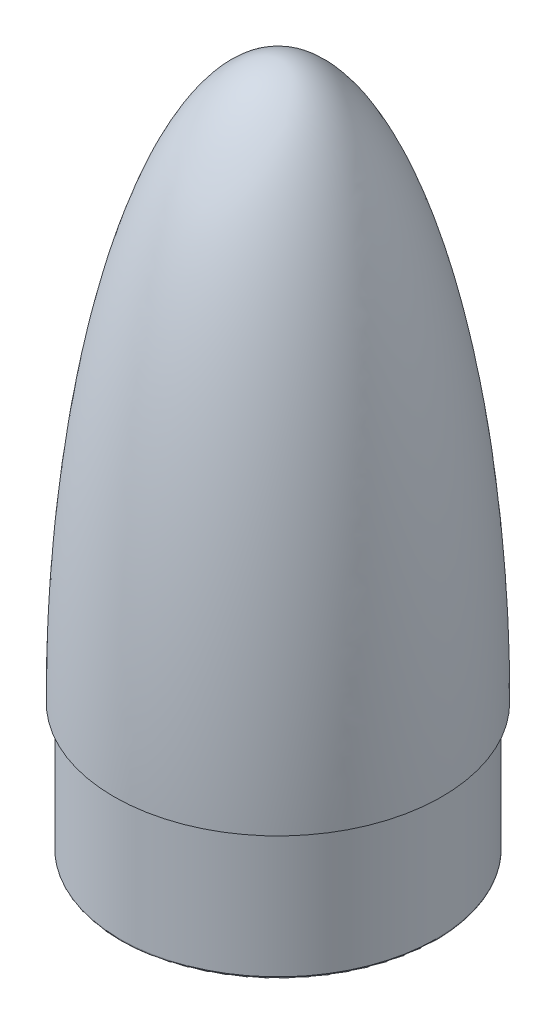
ISO-10303-21;
HEADER;
FILE_DESCRIPTION(('STEP AP214'),'2;1');
FILE_NAME('part.step','',(''),(''),'','','');
FILE_SCHEMA(('AUTOMOTIVE_DESIGN { 1 0 10303 214 1 1 1 1 }'));
ENDSEC;
DATA;
#1=APPLICATION_CONTEXT('core data for automotive mechanical design processes');
#2=APPLICATION_PROTOCOL_DEFINITION('international standard','automotive_design',2000,#1);
#3=PRODUCT_CONTEXT('',#1,'mechanical');
#4=PRODUCT('Part','Part','',(#3));
#5=PRODUCT_RELATED_PRODUCT_CATEGORY('part','',(#4));
#6=PRODUCT_DEFINITION_FORMATION('','',#4);
#7=PRODUCT_DEFINITION_CONTEXT('part definition',#1,'design');
#8=PRODUCT_DEFINITION('design','',#6,#7);
#9=PRODUCT_DEFINITION_SHAPE('','',#8);
#10=(LENGTH_UNIT() NAMED_UNIT(*) SI_UNIT(.MILLI.,.METRE.));
#11=(NAMED_UNIT(*) PLANE_ANGLE_UNIT() SI_UNIT($,.RADIAN.));
#12=(NAMED_UNIT(*) SI_UNIT($,.STERADIAN.) SOLID_ANGLE_UNIT());
#13=UNCERTAINTY_MEASURE_WITH_UNIT(LENGTH_MEASURE(1.E-05),#10,'distance_accuracy_value','');
#14=(GEOMETRIC_REPRESENTATION_CONTEXT(3) GLOBAL_UNCERTAINTY_ASSIGNED_CONTEXT((#13)) GLOBAL_UNIT_ASSIGNED_CONTEXT((#10,
#11,#12)) REPRESENTATION_CONTEXT('',''));
#15=CARTESIAN_POINT('',(0.,0.,0.));
#16=DIRECTION('',(0.,0.,1.));
#17=DIRECTION('',(1.,0.,0.));
#18=AXIS2_PLACEMENT_3D('',#15,#16,#17);
#19=CARTESIAN_POINT('',(0.,30.,0.));
#20=DIRECTION('',(0.,-1.,0.));
#21=DIRECTION('',(0.,0.,-1.));
#22=AXIS2_PLACEMENT_3D('',#19,#20,#21);
#23=CYLINDRICAL_SURFACE('',#22,36.9);
#24=CARTESIAN_POINT('',(0.,0.5,0.));
#25=DIRECTION('',(0.,1.,0.));
#26=DIRECTION('',(0.,0.,1.));
#27=AXIS2_PLACEMENT_3D('',#24,#25,#26);
#28=CIRCLE('',#27,36.9);
#29=CARTESIAN_POINT('',(0.,0.5,36.9));
#30=VERTEX_POINT('',#29);
#31=EDGE_CURVE('E85',#30,#30,#28,.T.);
#32=ORIENTED_EDGE('',*,*,#31,.T.);
#33=EDGE_LOOP('',(#32));
#34=FACE_BOUND('',#33,.T.);
#35=CARTESIAN_POINT('',(0.,30.,0.));
#36=DIRECTION('',(0.,1.,0.));
#37=DIRECTION('',(0.,0.,1.));
#38=AXIS2_PLACEMENT_3D('',#35,#36,#37);
#39=CIRCLE('',#38,36.9);
#40=CARTESIAN_POINT('',(0.,30.,36.9));
#41=VERTEX_POINT('',#40);
#42=EDGE_CURVE('E94',#41,#41,#39,.T.);
#43=ORIENTED_EDGE('',*,*,#42,.F.);
#44=EDGE_LOOP('',(#43));
#45=FACE_BOUND('',#44,.T.);
#46=ADVANCED_FACE('F35',(#34,#45),#23,.T.);
#47=CARTESIAN_POINT('',(0.,0.,0.));
#48=DIRECTION('',(0.,1.,0.));
#49=DIRECTION('',(0.,0.,1.));
#50=AXIS2_PLACEMENT_3D('',#47,#48,#49);
#51=PLANE('',#50);
#52=CARTESIAN_POINT('',(0.,0.,0.));
#53=DIRECTION('',(0.,1.,0.));
#54=DIRECTION('',(0.,0.,1.));
#55=AXIS2_PLACEMENT_3D('',#52,#53,#54);
#56=CIRCLE('',#55,36.4);
#57=CARTESIAN_POINT('',(0.,0.,36.4));
#58=VERTEX_POINT('',#57);
#59=EDGE_CURVE('E43',#58,#58,#56,.F.);
#60=ORIENTED_EDGE('',*,*,#59,.T.);
#61=EDGE_LOOP('',(#60));
#62=FACE_BOUND('',#61,.T.);
#63=CARTESIAN_POINT('',(0.,0.,0.));
#64=DIRECTION('',(0.,1.,0.));
#65=DIRECTION('',(0.,0.,1.));
#66=AXIS2_PLACEMENT_3D('',#63,#64,#65);
#67=CIRCLE('',#66,35.7);
#68=CARTESIAN_POINT('',(0.,0.,35.7));
#69=VERTEX_POINT('',#68);
#70=EDGE_CURVE('E93',#69,#69,#67,.T.);
#71=ORIENTED_EDGE('',*,*,#70,.T.);
#72=EDGE_LOOP('',(#71));
#73=FACE_BOUND('',#72,.T.);
#74=ADVANCED_FACE('F65',(#62,#73),#51,.F.);
#75=CARTESIAN_POINT('',(0.,30.,0.));
#76=DIRECTION('',(0.,1.,0.));
#77=DIRECTION('',(0.,0.,1.));
#78=AXIS2_PLACEMENT_3D('',#75,#76,#77);
#79=PLANE('',#78);
#80=ORIENTED_EDGE('',*,*,#42,.T.);
#81=EDGE_LOOP('',(#80));
#82=FACE_BOUND('',#81,.T.);
#83=CARTESIAN_POINT('',(0.,30.,0.));
#84=DIRECTION('',(0.,1.,0.));
#85=DIRECTION('',(0.,0.,1.));
#86=AXIS2_PLACEMENT_3D('',#83,#84,#85);
#87=CIRCLE('',#86,38.3);
#88=CARTESIAN_POINT('',(0.,30.,38.3));
#89=VERTEX_POINT('',#88);
#90=EDGE_CURVE('E83',#89,#89,#87,.T.);
#91=ORIENTED_EDGE('',*,*,#90,.F.);
#92=EDGE_LOOP('',(#91));
#93=FACE_BOUND('',#92,.T.);
#94=ADVANCED_FACE('F71',(#82,#93),#79,.F.);
#95=CARTESIAN_POINT('',(0.,30.,0.));
#96=DIRECTION('',(1.,0.,0.));
#97=DIRECTION('',(0.,1.,0.));
#98=AXIS2_PLACEMENT_3D('',#95,#96,#97);
#99=ELLIPSE('',#98,130.,38.3);
#100=TRIMMED_CURVE('',#99,(PARAMETER_VALUE(0.)),(PARAMETER_VALUE(3.14159265358979)),.T.,.PARAMETER.);
#101=CARTESIAN_POINT('',(0.,-100.,0.));
#102=DIRECTION('',(0.,1.,0.));
#103=AXIS1_PLACEMENT('',#101,#102);
#104=SURFACE_OF_REVOLUTION('',#100,#103);
#105=CARTESIAN_POINT('',(0.,160.,0.));
#106=VERTEX_POINT('',#105);
#107=VERTEX_LOOP('',#106);
#108=FACE_BOUND('',#107,.T.);
#109=ORIENTED_EDGE('',*,*,#90,.T.);
#110=EDGE_LOOP('',(#109));
#111=FACE_BOUND('',#110,.T.);
#112=ADVANCED_FACE('F60',(#108,#111),#104,.F.);
#113=CARTESIAN_POINT('',(0.,30.,0.));
#114=DIRECTION('',(0.,-1.,0.));
#115=DIRECTION('',(0.,0.,-1.));
#116=AXIS2_PLACEMENT_3D('',#113,#114,#115);
#117=CYLINDRICAL_SURFACE('',#116,35.7);
#118=ORIENTED_EDGE('',*,*,#70,.F.);
#119=EDGE_LOOP('',(#118));
#120=FACE_BOUND('',#119,.T.);
#121=CARTESIAN_POINT('',(0.,31.2,0.));
#122=DIRECTION('',(0.,1.,0.));
#123=DIRECTION('',(0.,0.,1.));
#124=AXIS2_PLACEMENT_3D('',#121,#122,#123);
#125=CIRCLE('',#124,35.7);
#126=CARTESIAN_POINT('',(0.,31.2,35.7));
#127=VERTEX_POINT('',#126);
#128=EDGE_CURVE('E95',#127,#127,#125,.T.);
#129=ORIENTED_EDGE('',*,*,#128,.T.);
#130=EDGE_LOOP('',(#129));
#131=FACE_BOUND('',#130,.T.);
#132=ADVANCED_FACE('F52',(#120,#131),#117,.F.);
#133=CARTESIAN_POINT('',(0.,30.,0.));
#134=DIRECTION('',(1.,0.,0.));
#135=DIRECTION('',(0.,1.,0.));
#136=AXIS2_PLACEMENT_3D('',#133,#134,#135);
#137=ELLIPSE('',#136,130.,38.3);
#138=TRIMMED_CURVE('',#137,(PARAMETER_VALUE(0.)),(PARAMETER_VALUE(3.14159265358979)),.T.,.PARAMETER.);
#139=CARTESIAN_POINT('',(0.,-100.,0.));
#140=DIRECTION('',(0.,1.,0.));
#141=AXIS1_PLACEMENT('',#139,#140);
#142=SURFACE_OF_REVOLUTION('',#138,#141);
#143=OFFSET_SURFACE('',#142,1.2,.F.);
#144=CARTESIAN_POINT('',(0.,33.7532178480183,0.));
#145=DIRECTION('',(0.,1.,0.));
#146=DIRECTION('',(0.,0.,1.));
#147=AXIS2_PLACEMENT_3D('',#144,#145,#146);
#148=CIRCLE('',#147,37.0839910240287);
#149=CARTESIAN_POINT('',(0.,33.7532178480183,37.0839910240287));
#150=VERTEX_POINT('',#149);
#151=EDGE_CURVE('E12',#150,#150,#148,.F.);
#152=ORIENTED_EDGE('',*,*,#151,.T.);
#153=EDGE_LOOP('',(#152));
#154=FACE_BOUND('',#153,.T.);
#155=CARTESIAN_POINT('',(0.,158.8,0.));
#156=VERTEX_POINT('',#155);
#157=VERTEX_LOOP('',#156);
#158=FACE_BOUND('',#157,.T.);
#159=ADVANCED_FACE('F49',(#154,#158),#143,.T.);
#160=CARTESIAN_POINT('',(0.,0.5,0.));
#161=DIRECTION('',(0.,1.,0.));
#162=DIRECTION('',(0.,0.,1.));
#163=AXIS2_PLACEMENT_3D('',#160,#161,#162);
#164=TOROIDAL_SURFACE('',#163,36.4,0.5);
#165=ORIENTED_EDGE('',*,*,#59,.F.);
#166=EDGE_LOOP('',(#165));
#167=FACE_BOUND('',#166,.T.);
#168=ORIENTED_EDGE('',*,*,#31,.F.);
#169=EDGE_LOOP('',(#168));
#170=FACE_BOUND('',#169,.T.);
#171=ADVANCED_FACE('F51',(#167,#170),#164,.T.);
#172=CARTESIAN_POINT('',(0.,33.727621000012,0.));
#173=DIRECTION('',(0.,1.,0.));
#174=DIRECTION('',(0.,0.,1.));
#175=AXIS2_PLACEMENT_3D('',#172,#173,#174);
#176=TOROIDAL_SURFACE('',#175,34.0841002257874,3.);
#177=ORIENTED_EDGE('',*,*,#151,.F.);
#178=EDGE_LOOP('',(#177));
#179=FACE_BOUND('',#178,.T.);
#180=ORIENTED_EDGE('',*,*,#128,.F.);
#181=EDGE_LOOP('',(#180));
#182=FACE_BOUND('',#181,.T.);
#183=ADVANCED_FACE('F37',(#179,#182),#176,.F.);
#184=CLOSED_SHELL('',(#46,#74,#94,#112,#132,#159,#171,#183));
#185=MANIFOLD_SOLID_BREP('B2',#184);
#186=ADVANCED_BREP_SHAPE_REPRESENTATION('',(#18,#185),#14);
#187=SHAPE_DEFINITION_REPRESENTATION(#9,#186);
ENDSEC;
END-ISO-10303-21;
